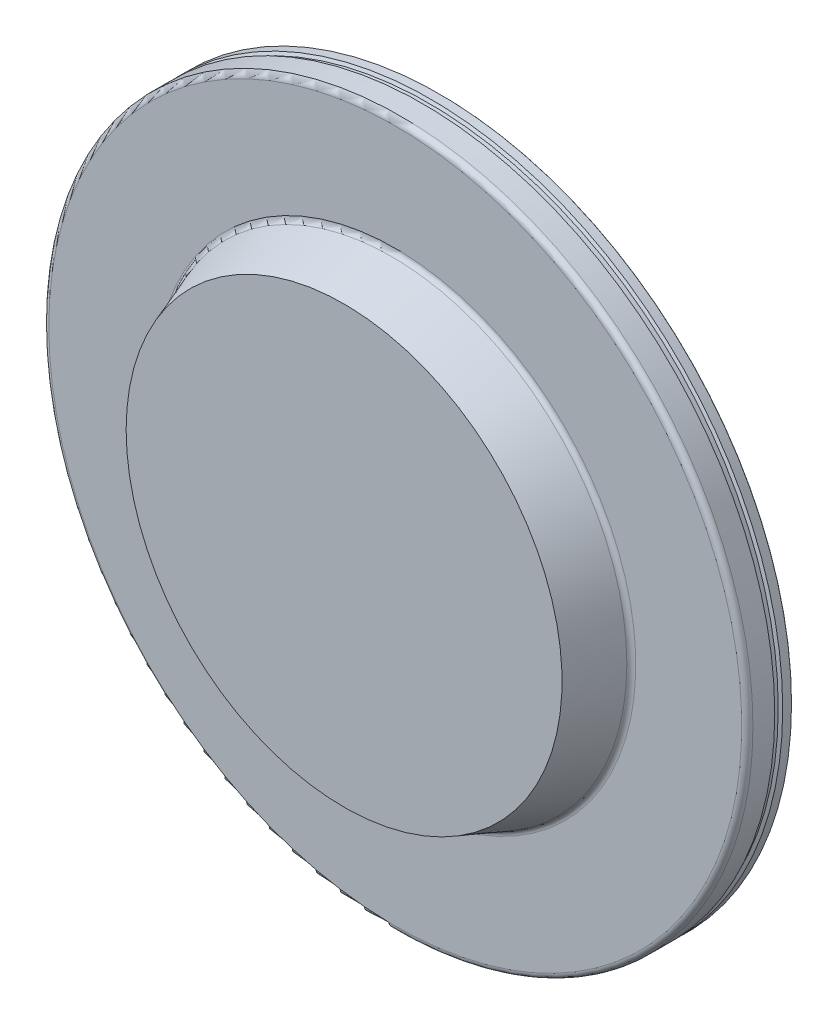
ISO-10303-21;
HEADER;
FILE_DESCRIPTION(('STEP AP214'),'2;1');
FILE_NAME('part.step','',(''),(''),'','','');
FILE_SCHEMA(('AUTOMOTIVE_DESIGN { 1 0 10303 214 1 1 1 1 }'));
ENDSEC;
DATA;
#1=APPLICATION_CONTEXT('core data for automotive mechanical design processes');
#2=APPLICATION_PROTOCOL_DEFINITION('international standard','automotive_design',2000,#1);
#3=PRODUCT_CONTEXT('',#1,'mechanical');
#4=PRODUCT('Part','Part','',(#3));
#5=PRODUCT_RELATED_PRODUCT_CATEGORY('part','',(#4));
#6=PRODUCT_DEFINITION_FORMATION('','',#4);
#7=PRODUCT_DEFINITION_CONTEXT('part definition',#1,'design');
#8=PRODUCT_DEFINITION('design','',#6,#7);
#9=PRODUCT_DEFINITION_SHAPE('','',#8);
#10=(LENGTH_UNIT() NAMED_UNIT(*) SI_UNIT(.MILLI.,.METRE.));
#11=(NAMED_UNIT(*) PLANE_ANGLE_UNIT() SI_UNIT($,.RADIAN.));
#12=(NAMED_UNIT(*) SI_UNIT($,.STERADIAN.) SOLID_ANGLE_UNIT());
#13=UNCERTAINTY_MEASURE_WITH_UNIT(LENGTH_MEASURE(1.E-05),#10,'distance_accuracy_value','');
#14=(GEOMETRIC_REPRESENTATION_CONTEXT(3) GLOBAL_UNCERTAINTY_ASSIGNED_CONTEXT((#13)) GLOBAL_UNIT_ASSIGNED_CONTEXT((#10,
#11,#12)) REPRESENTATION_CONTEXT('',''));
#15=CARTESIAN_POINT('',(0.,0.,0.));
#16=DIRECTION('',(0.,0.,1.));
#17=DIRECTION('',(1.,0.,0.));
#18=AXIS2_PLACEMENT_3D('',#15,#16,#17);
#19=CARTESIAN_POINT('',(0.,0.,0.));
#20=DIRECTION('',(0.,0.,-1.));
#21=DIRECTION('',(0.,-1.,0.));
#22=AXIS2_PLACEMENT_3D('',#19,#20,#21);
#23=PLANE('',#22);
#24=CARTESIAN_POINT('',(0.,0.,0.));
#25=DIRECTION('',(0.,0.,-1.));
#26=DIRECTION('',(-1.,0.,0.));
#27=AXIS2_PLACEMENT_3D('',#24,#25,#26);
#28=CIRCLE('',#27,31.45);
#29=CARTESIAN_POINT('',(-31.45,0.,0.));
#30=VERTEX_POINT('',#29);
#31=EDGE_CURVE('E87',#30,#30,#28,.T.);
#32=ORIENTED_EDGE('',*,*,#31,.T.);
#33=EDGE_LOOP('',(#32));
#34=FACE_BOUND('',#33,.T.);
#35=ADVANCED_FACE('F15',(#34),#23,.T.);
#36=CARTESIAN_POINT('',(0.,31.,4.));
#37=DIRECTION('',(0.,0.,1.));
#38=DIRECTION('',(1.,0.,0.));
#39=AXIS2_PLACEMENT_3D('',#36,#37,#38);
#40=PLANE('',#39);
#41=CARTESIAN_POINT('',(0.,0.,4.));
#42=DIRECTION('',(0.,0.,-1.));
#43=DIRECTION('',(-1.,0.,0.));
#44=AXIS2_PLACEMENT_3D('',#41,#42,#43);
#45=CIRCLE('',#44,21.5171602360909);
#46=CARTESIAN_POINT('',(-21.5171602360909,0.,4.));
#47=VERTEX_POINT('',#46);
#48=EDGE_CURVE('E18',#47,#47,#45,.T.);
#49=ORIENTED_EDGE('',*,*,#48,.T.);
#50=EDGE_LOOP('',(#49));
#51=FACE_BOUND('',#50,.T.);
#52=CARTESIAN_POINT('',(0.,0.,4.));
#53=DIRECTION('',(0.,0.,-1.));
#54=DIRECTION('',(-1.,0.,0.));
#55=AXIS2_PLACEMENT_3D('',#52,#53,#54);
#56=CIRCLE('',#55,31.);
#57=CARTESIAN_POINT('',(-31.,0.,4.));
#58=VERTEX_POINT('',#57);
#59=EDGE_CURVE('E45',#58,#58,#56,.T.);
#60=ORIENTED_EDGE('',*,*,#59,.F.);
#61=EDGE_LOOP('',(#60));
#62=FACE_BOUND('',#61,.T.);
#63=ADVANCED_FACE('F58',(#51,#62),#40,.T.);
#64=CARTESIAN_POINT('',(0.,19.5,8.5802));
#65=DIRECTION('',(0.,0.,1.));
#66=DIRECTION('',(1.,0.,0.));
#67=AXIS2_PLACEMENT_3D('',#64,#65,#66);
#68=PLANE('',#67);
#69=CARTESIAN_POINT('',(0.,0.,8.5802));
#70=DIRECTION('',(0.,0.,-1.));
#71=DIRECTION('',(-1.,0.,0.));
#72=AXIS2_PLACEMENT_3D('',#69,#70,#71);
#73=CIRCLE('',#72,19.5);
#74=CARTESIAN_POINT('',(-19.5,0.,8.5802));
#75=VERTEX_POINT('',#74);
#76=EDGE_CURVE('E10',#75,#75,#73,.T.);
#77=ORIENTED_EDGE('',*,*,#76,.F.);
#78=EDGE_LOOP('',(#77));
#79=FACE_BOUND('',#78,.T.);
#80=ADVANCED_FACE('F75',(#79),#68,.T.);
#81=CARTESIAN_POINT('',(0.,0.,4.32898992833717));
#82=DIRECTION('',(0.,0.,-1.));
#83=DIRECTION('',(-1.,0.,0.));
#84=AXIS2_PLACEMENT_3D('',#81,#82,#83);
#85=CONICAL_SURFACE('',#84,21.0473139256979,0.349065850398867);
#86=CARTESIAN_POINT('',(0.,0.,4.32898992833717));
#87=DIRECTION('',(0.,0.,-1.));
#88=DIRECTION('',(-1.,0.,0.));
#89=AXIS2_PLACEMENT_3D('',#86,#87,#88);
#90=CIRCLE('',#89,21.0473139256979);
#91=CARTESIAN_POINT('',(-21.0473139256979,0.,4.32898992833717));
#92=VERTEX_POINT('',#91);
#93=EDGE_CURVE('E23',#92,#92,#90,.T.);
#94=ORIENTED_EDGE('',*,*,#93,.F.);
#95=EDGE_LOOP('',(#94));
#96=FACE_BOUND('',#95,.T.);
#97=ORIENTED_EDGE('',*,*,#76,.T.);
#98=EDGE_LOOP('',(#97));
#99=FACE_BOUND('',#98,.T.);
#100=ADVANCED_FACE('F64',(#96,#99),#85,.T.);
#101=CARTESIAN_POINT('',(0.,0.,4.5));
#102=DIRECTION('',(0.,0.,-1.));
#103=DIRECTION('',(-1.,0.,0.));
#104=AXIS2_PLACEMENT_3D('',#101,#102,#103);
#105=TOROIDAL_SURFACE('',#104,21.5171602360909,0.5);
#106=ORIENTED_EDGE('',*,*,#93,.T.);
#107=EDGE_LOOP('',(#106));
#108=FACE_BOUND('',#107,.T.);
#109=ORIENTED_EDGE('',*,*,#48,.F.);
#110=EDGE_LOOP('',(#109));
#111=FACE_BOUND('',#110,.T.);
#112=ADVANCED_FACE('F61',(#108,#111),#105,.F.);
#113=CARTESIAN_POINT('',(0.,0.,3.5));
#114=DIRECTION('',(0.,0.,-1.));
#115=DIRECTION('',(-1.,0.,0.));
#116=AXIS2_PLACEMENT_3D('',#113,#114,#115);
#117=TOROIDAL_SURFACE('',#116,31.,0.5);
#118=CARTESIAN_POINT('',(0.,0.,3.5));
#119=DIRECTION('',(0.,0.,-1.));
#120=DIRECTION('',(-1.,0.,0.));
#121=AXIS2_PLACEMENT_3D('',#118,#119,#120);
#122=CIRCLE('',#121,31.5);
#123=CARTESIAN_POINT('',(-31.5,0.,3.5));
#124=VERTEX_POINT('',#123);
#125=EDGE_CURVE('E42',#124,#124,#122,.T.);
#126=ORIENTED_EDGE('',*,*,#125,.F.);
#127=EDGE_LOOP('',(#126));
#128=FACE_BOUND('',#127,.T.);
#129=ORIENTED_EDGE('',*,*,#59,.T.);
#130=EDGE_LOOP('',(#129));
#131=FACE_BOUND('',#130,.T.);
#132=ADVANCED_FACE('F63',(#128,#131),#117,.T.);
#133=CARTESIAN_POINT('',(0.,0.,0.));
#134=DIRECTION('',(0.,0.,-1.));
#135=DIRECTION('',(-1.,0.,0.));
#136=AXIS2_PLACEMENT_3D('',#133,#134,#135);
#137=CYLINDRICAL_SURFACE('',#136,31.5);
#138=CARTESIAN_POINT('',(0.,0.,1.5494));
#139=DIRECTION('',(0.,0.,-1.));
#140=DIRECTION('',(-1.,0.,0.));
#141=AXIS2_PLACEMENT_3D('',#138,#139,#140);
#142=CIRCLE('',#141,31.5);
#143=CARTESIAN_POINT('',(-31.5,0.,1.5494));
#144=VERTEX_POINT('',#143);
#145=EDGE_CURVE('E38',#144,#144,#142,.T.);
#146=ORIENTED_EDGE('',*,*,#145,.F.);
#147=EDGE_LOOP('',(#146));
#148=FACE_BOUND('',#147,.T.);
#149=ORIENTED_EDGE('',*,*,#125,.T.);
#150=EDGE_LOOP('',(#149));
#151=FACE_BOUND('',#150,.T.);
#152=ADVANCED_FACE('F72',(#148,#151),#137,.T.);
#153=CARTESIAN_POINT('',(0.,0.,1.40275303162583));
#154=DIRECTION('',(0.,0.,1.));
#155=DIRECTION('',(1.,0.,0.));
#156=AXIS2_PLACEMENT_3D('',#153,#154,#155);
#157=CONICAL_SURFACE('',#156,31.246,1.0471975511966);
#158=ORIENTED_EDGE('',*,*,#145,.T.);
#159=EDGE_LOOP('',(#158));
#160=FACE_BOUND('',#159,.T.);
#161=CARTESIAN_POINT('',(0.,0.,1.40275303162583));
#162=DIRECTION('',(0.,0.,-1.));
#163=DIRECTION('',(-1.,0.,0.));
#164=AXIS2_PLACEMENT_3D('',#161,#162,#163);
#165=CIRCLE('',#164,31.246);
#166=CARTESIAN_POINT('',(-31.246,0.,1.40275303162583));
#167=VERTEX_POINT('',#166);
#168=EDGE_CURVE('E36',#167,#167,#165,.T.);
#169=ORIENTED_EDGE('',*,*,#168,.F.);
#170=EDGE_LOOP('',(#169));
#171=FACE_BOUND('',#170,.T.);
#172=ADVANCED_FACE('F116',(#160,#171),#157,.T.);
#173=CARTESIAN_POINT('',(0.,0.,0.));
#174=DIRECTION('',(0.,0.,-1.));
#175=DIRECTION('',(-1.,0.,0.));
#176=AXIS2_PLACEMENT_3D('',#173,#174,#175);
#177=CYLINDRICAL_SURFACE('',#176,31.246);
#178=CARTESIAN_POINT('',(0.,0.,0.984846968374167));
#179=DIRECTION('',(0.,0.,-1.));
#180=DIRECTION('',(-1.,0.,0.));
#181=AXIS2_PLACEMENT_3D('',#178,#179,#180);
#182=CIRCLE('',#181,31.246);
#183=CARTESIAN_POINT('',(-31.246,0.,0.984846968374167));
#184=VERTEX_POINT('',#183);
#185=EDGE_CURVE('E101',#184,#184,#182,.T.);
#186=ORIENTED_EDGE('',*,*,#185,.F.);
#187=EDGE_LOOP('',(#186));
#188=FACE_BOUND('',#187,.T.);
#189=ORIENTED_EDGE('',*,*,#168,.T.);
#190=EDGE_LOOP('',(#189));
#191=FACE_BOUND('',#190,.T.);
#192=ADVANCED_FACE('F114',(#188,#191),#177,.T.);
#193=CARTESIAN_POINT('',(0.,0.,0.8382));
#194=DIRECTION('',(0.,0.,-1.));
#195=DIRECTION('',(-1.,0.,0.));
#196=AXIS2_PLACEMENT_3D('',#193,#194,#195);
#197=CONICAL_SURFACE('',#196,31.5,1.0471975511966);
#198=CARTESIAN_POINT('',(0.,0.,0.8382));
#199=DIRECTION('',(0.,0.,-1.));
#200=DIRECTION('',(-1.,0.,0.));
#201=AXIS2_PLACEMENT_3D('',#198,#199,#200);
#202=CIRCLE('',#201,31.5);
#203=CARTESIAN_POINT('',(-31.5,0.,0.8382));
#204=VERTEX_POINT('',#203);
#205=EDGE_CURVE('E96',#204,#204,#202,.T.);
#206=ORIENTED_EDGE('',*,*,#205,.F.);
#207=EDGE_LOOP('',(#206));
#208=FACE_BOUND('',#207,.T.);
#209=ORIENTED_EDGE('',*,*,#185,.T.);
#210=EDGE_LOOP('',(#209));
#211=FACE_BOUND('',#210,.T.);
#212=ADVANCED_FACE('F125',(#208,#211),#197,.T.);
#213=CARTESIAN_POINT('',(0.,0.,0.));
#214=DIRECTION('',(0.,0.,-1.));
#215=DIRECTION('',(-1.,0.,0.));
#216=AXIS2_PLACEMENT_3D('',#213,#214,#215);
#217=CYLINDRICAL_SURFACE('',#216,31.5);
#218=CARTESIAN_POINT('',(0.,0.,0.05));
#219=DIRECTION('',(0.,0.,-1.));
#220=DIRECTION('',(-1.,0.,0.));
#221=AXIS2_PLACEMENT_3D('',#218,#219,#220);
#222=CIRCLE('',#221,31.5);
#223=CARTESIAN_POINT('',(-31.5,0.,0.05));
#224=VERTEX_POINT('',#223);
#225=EDGE_CURVE('E90',#224,#224,#222,.T.);
#226=ORIENTED_EDGE('',*,*,#225,.F.);
#227=EDGE_LOOP('',(#226));
#228=FACE_BOUND('',#227,.T.);
#229=ORIENTED_EDGE('',*,*,#205,.T.);
#230=EDGE_LOOP('',(#229));
#231=FACE_BOUND('',#230,.T.);
#232=ADVANCED_FACE('F136',(#228,#231),#217,.T.);
#233=CARTESIAN_POINT('',(0.,0.,0.));
#234=DIRECTION('',(0.,0.,1.));
#235=DIRECTION('',(1.,0.,0.));
#236=AXIS2_PLACEMENT_3D('',#233,#234,#235);
#237=CONICAL_SURFACE('',#236,31.45,0.785398163397462);
#238=ORIENTED_EDGE('',*,*,#225,.T.);
#239=EDGE_LOOP('',(#238));
#240=FACE_BOUND('',#239,.T.);
#241=ORIENTED_EDGE('',*,*,#31,.F.);
#242=EDGE_LOOP('',(#241));
#243=FACE_BOUND('',#242,.T.);
#244=ADVANCED_FACE('F140',(#240,#243),#237,.T.);
#245=CLOSED_SHELL('',(#35,#63,#80,#100,#112,#132,#152,#172,#192,#212,#232,#244));
#246=MANIFOLD_SOLID_BREP('B1',#245);
#247=ADVANCED_BREP_SHAPE_REPRESENTATION('',(#18,#246),#14);
#248=SHAPE_DEFINITION_REPRESENTATION(#9,#247);
ENDSEC;
END-ISO-10303-21;
